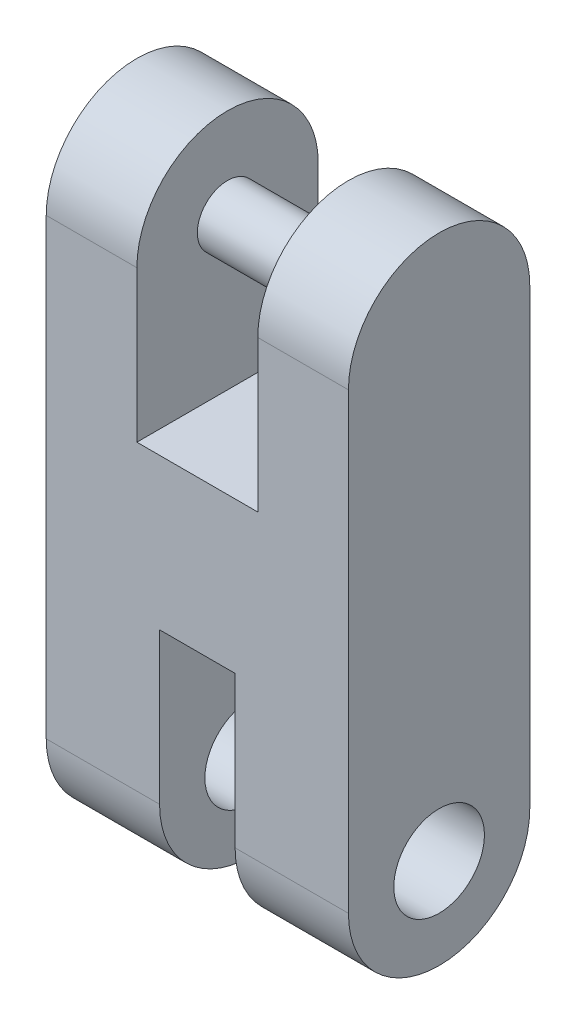
ISO-10303-21;
HEADER;
FILE_DESCRIPTION(('STEP AP214'),'2;1');
FILE_NAME('part.step','',(''),(''),'','','');
FILE_SCHEMA(('AUTOMOTIVE_DESIGN { 1 0 10303 214 1 1 1 1 }'));
ENDSEC;
DATA;
#1=APPLICATION_CONTEXT('core data for automotive mechanical design processes');
#2=APPLICATION_PROTOCOL_DEFINITION('international standard','automotive_design',2000,#1);
#3=PRODUCT_CONTEXT('',#1,'mechanical');
#4=PRODUCT('Part','Part','',(#3));
#5=PRODUCT_RELATED_PRODUCT_CATEGORY('part','',(#4));
#6=PRODUCT_DEFINITION_FORMATION('','',#4);
#7=PRODUCT_DEFINITION_CONTEXT('part definition',#1,'design');
#8=PRODUCT_DEFINITION('design','',#6,#7);
#9=PRODUCT_DEFINITION_SHAPE('','',#8);
#10=(LENGTH_UNIT() NAMED_UNIT(*) SI_UNIT(.MILLI.,.METRE.));
#11=(NAMED_UNIT(*) PLANE_ANGLE_UNIT() SI_UNIT($,.RADIAN.));
#12=(NAMED_UNIT(*) SI_UNIT($,.STERADIAN.) SOLID_ANGLE_UNIT());
#13=UNCERTAINTY_MEASURE_WITH_UNIT(LENGTH_MEASURE(1.E-05),#10,'distance_accuracy_value','');
#14=(GEOMETRIC_REPRESENTATION_CONTEXT(3) GLOBAL_UNCERTAINTY_ASSIGNED_CONTEXT((#13)) GLOBAL_UNIT_ASSIGNED_CONTEXT((#10,
#11,#12)) REPRESENTATION_CONTEXT('',''));
#15=CARTESIAN_POINT('',(0.,0.,0.));
#16=DIRECTION('',(0.,0.,1.));
#17=DIRECTION('',(1.,0.,0.));
#18=AXIS2_PLACEMENT_3D('',#15,#16,#17);
#19=CARTESIAN_POINT('',(-6.25,3.,3.));
#20=DIRECTION('',(1.,0.,0.));
#21=DIRECTION('',(0.,1.,0.));
#22=AXIS2_PLACEMENT_3D('',#19,#20,#21);
#23=CYLINDRICAL_SURFACE('',#22,3.);
#24=DIRECTION('',(1.,0.,0.));
#25=VECTOR('',#24,1.);
#26=CARTESIAN_POINT('',(0.,3.,0.));
#27=LINE('',#26,#25);
#28=CARTESIAN_POINT('',(-6.25,3.,0.));
#29=VERTEX_POINT('',#28);
#30=CARTESIAN_POINT('',(-10.,3.,0.));
#31=VERTEX_POINT('',#30);
#32=EDGE_CURVE('E259',#29,#31,#27,.F.);
#33=ORIENTED_EDGE('',*,*,#32,.F.);
#34=CARTESIAN_POINT('',(-6.25,3.,3.));
#35=DIRECTION('',(-1.,0.,0.));
#36=DIRECTION('',(0.,0.,1.));
#37=AXIS2_PLACEMENT_3D('',#34,#35,#36);
#38=CIRCLE('',#37,3.);
#39=CARTESIAN_POINT('',(-6.25,3.,6.));
#40=VERTEX_POINT('',#39);
#41=EDGE_CURVE('E55',#40,#29,#38,.F.);
#42=ORIENTED_EDGE('',*,*,#41,.F.);
#43=DIRECTION('',(-1.,0.,0.));
#44=VECTOR('',#43,1.);
#45=CARTESIAN_POINT('',(-6.25,3.,6.));
#46=LINE('',#45,#44);
#47=CARTESIAN_POINT('',(-10.,3.,6.));
#48=VERTEX_POINT('',#47);
#49=EDGE_CURVE('E263',#48,#40,#46,.F.);
#50=ORIENTED_EDGE('',*,*,#49,.F.);
#51=CARTESIAN_POINT('',(-10.,3.,3.));
#52=DIRECTION('',(1.,0.,0.));
#53=DIRECTION('',(0.,1.,0.));
#54=AXIS2_PLACEMENT_3D('',#51,#52,#53);
#55=CIRCLE('',#54,3.);
#56=EDGE_CURVE('E11',#31,#48,#55,.F.);
#57=ORIENTED_EDGE('',*,*,#56,.F.);
#58=EDGE_LOOP('',(#33,#42,#50,#57));
#59=FACE_BOUND('',#58,.T.);
#60=ADVANCED_FACE('F45',(#59),#23,.T.);
#61=CARTESIAN_POINT('',(-10.,18.,3.));
#62=DIRECTION('',(-1.,0.,0.));
#63=DIRECTION('',(0.,-1.,0.));
#64=AXIS2_PLACEMENT_3D('',#61,#62,#63);
#65=CYLINDRICAL_SURFACE('',#64,3.);
#66=DIRECTION('',(-1.,0.,0.));
#67=VECTOR('',#66,1.);
#68=CARTESIAN_POINT('',(0.,18.,0.));
#69=LINE('',#68,#67);
#70=CARTESIAN_POINT('',(-10.,18.,0.));
#71=VERTEX_POINT('',#70);
#72=CARTESIAN_POINT('',(-7.,18.,0.));
#73=VERTEX_POINT('',#72);
#74=EDGE_CURVE('E245',#71,#73,#69,.F.);
#75=ORIENTED_EDGE('',*,*,#74,.F.);
#76=CARTESIAN_POINT('',(-10.,18.,3.));
#77=DIRECTION('',(1.,0.,0.));
#78=DIRECTION('',(0.,1.,0.));
#79=AXIS2_PLACEMENT_3D('',#76,#77,#78);
#80=CIRCLE('',#79,3.);
#81=CARTESIAN_POINT('',(-10.,18.,6.));
#82=VERTEX_POINT('',#81);
#83=EDGE_CURVE('E253',#82,#71,#80,.F.);
#84=ORIENTED_EDGE('',*,*,#83,.F.);
#85=DIRECTION('',(1.,0.,0.));
#86=VECTOR('',#85,1.);
#87=CARTESIAN_POINT('',(-10.,18.,6.));
#88=LINE('',#87,#86);
#89=CARTESIAN_POINT('',(-7.,18.,6.));
#90=VERTEX_POINT('',#89);
#91=EDGE_CURVE('E249',#90,#82,#88,.F.);
#92=ORIENTED_EDGE('',*,*,#91,.F.);
#93=CARTESIAN_POINT('',(-7.,18.,3.));
#94=DIRECTION('',(-1.,0.,0.));
#95=DIRECTION('',(0.,-1.,0.));
#96=AXIS2_PLACEMENT_3D('',#93,#94,#95);
#97=CIRCLE('',#96,3.);
#98=EDGE_CURVE('E256',#73,#90,#97,.F.);
#99=ORIENTED_EDGE('',*,*,#98,.F.);
#100=EDGE_LOOP('',(#75,#84,#92,#99));
#101=FACE_BOUND('',#100,.T.);
#102=ADVANCED_FACE('F290',(#101),#65,.T.);
#103=CARTESIAN_POINT('',(0.,18.,3.));
#104=DIRECTION('',(-1.,0.,0.));
#105=DIRECTION('',(0.,-1.,0.));
#106=AXIS2_PLACEMENT_3D('',#103,#104,#105);
#107=CYLINDRICAL_SURFACE('',#106,3.);
#108=DIRECTION('',(1.,0.,0.));
#109=VECTOR('',#108,1.);
#110=CARTESIAN_POINT('',(0.,18.,6.));
#111=LINE('',#110,#109);
#112=CARTESIAN_POINT('',(0.,18.,6.));
#113=VERTEX_POINT('',#112);
#114=CARTESIAN_POINT('',(-3.,18.,6.));
#115=VERTEX_POINT('',#114);
#116=EDGE_CURVE('E144',#113,#115,#111,.F.);
#117=ORIENTED_EDGE('',*,*,#116,.F.);
#118=CARTESIAN_POINT('',(0.,18.,3.));
#119=DIRECTION('',(-1.,0.,0.));
#120=DIRECTION('',(0.,0.,1.));
#121=AXIS2_PLACEMENT_3D('',#118,#119,#120);
#122=CIRCLE('',#121,3.);
#123=CARTESIAN_POINT('',(0.,18.,0.));
#124=VERTEX_POINT('',#123);
#125=EDGE_CURVE('E239',#124,#113,#122,.F.);
#126=ORIENTED_EDGE('',*,*,#125,.F.);
#127=DIRECTION('',(-1.,0.,0.));
#128=VECTOR('',#127,1.);
#129=CARTESIAN_POINT('',(0.,18.,0.));
#130=LINE('',#129,#128);
#131=CARTESIAN_POINT('',(-3.,18.,0.));
#132=VERTEX_POINT('',#131);
#133=EDGE_CURVE('E235',#132,#124,#130,.F.);
#134=ORIENTED_EDGE('',*,*,#133,.F.);
#135=CARTESIAN_POINT('',(-3.,18.,3.));
#136=DIRECTION('',(1.,0.,0.));
#137=DIRECTION('',(0.,1.,0.));
#138=AXIS2_PLACEMENT_3D('',#135,#136,#137);
#139=CIRCLE('',#138,3.);
#140=EDGE_CURVE('E242',#115,#132,#139,.F.);
#141=ORIENTED_EDGE('',*,*,#140,.F.);
#142=EDGE_LOOP('',(#117,#126,#134,#141));
#143=FACE_BOUND('',#142,.T.);
#144=ADVANCED_FACE('F310',(#143),#107,.T.);
#145=CARTESIAN_POINT('',(-7.5,3.,3.));
#146=DIRECTION('',(1.,0.,0.));
#147=DIRECTION('',(0.,1.,0.));
#148=AXIS2_PLACEMENT_3D('',#145,#146,#147);
#149=CYLINDRICAL_SURFACE('',#148,3.);
#150=DIRECTION('',(-1.,0.,0.));
#151=VECTOR('',#150,1.);
#152=CARTESIAN_POINT('',(-7.5,3.,6.));
#153=LINE('',#152,#151);
#154=CARTESIAN_POINT('',(-3.75,3.,6.));
#155=VERTEX_POINT('',#154);
#156=CARTESIAN_POINT('',(0.,3.,6.));
#157=VERTEX_POINT('',#156);
#158=EDGE_CURVE('E157',#155,#157,#153,.F.);
#159=ORIENTED_EDGE('',*,*,#158,.F.);
#160=CARTESIAN_POINT('',(-3.75,3.,3.));
#161=DIRECTION('',(1.,0.,0.));
#162=DIRECTION('',(0.,1.,0.));
#163=AXIS2_PLACEMENT_3D('',#160,#161,#162);
#164=CIRCLE('',#163,3.);
#165=CARTESIAN_POINT('',(-3.75,3.,0.));
#166=VERTEX_POINT('',#165);
#167=EDGE_CURVE('E227',#166,#155,#164,.F.);
#168=ORIENTED_EDGE('',*,*,#167,.F.);
#169=DIRECTION('',(1.,0.,0.));
#170=VECTOR('',#169,1.);
#171=CARTESIAN_POINT('',(0.,3.,0.));
#172=LINE('',#171,#170);
#173=CARTESIAN_POINT('',(0.,3.,0.));
#174=VERTEX_POINT('',#173);
#175=EDGE_CURVE('E223',#174,#166,#172,.F.);
#176=ORIENTED_EDGE('',*,*,#175,.F.);
#177=CARTESIAN_POINT('',(0.,3.,3.));
#178=DIRECTION('',(-1.,0.,0.));
#179=DIRECTION('',(0.,0.,1.));
#180=AXIS2_PLACEMENT_3D('',#177,#178,#179);
#181=CIRCLE('',#180,3.);
#182=EDGE_CURVE('E230',#157,#174,#181,.F.);
#183=ORIENTED_EDGE('',*,*,#182,.F.);
#184=EDGE_LOOP('',(#159,#168,#176,#183));
#185=FACE_BOUND('',#184,.T.);
#186=ADVANCED_FACE('F314',(#185),#149,.T.);
#187=CARTESIAN_POINT('',(0.,0.,6.));
#188=DIRECTION('',(-1.,0.,0.));
#189=DIRECTION('',(0.,0.,1.));
#190=AXIS2_PLACEMENT_3D('',#187,#188,#189);
#191=PLANE('',#190);
#192=CARTESIAN_POINT('',(0.,3.,3.));
#193=DIRECTION('',(1.,0.,0.));
#194=DIRECTION('',(0.,0.,-1.));
#195=AXIS2_PLACEMENT_3D('',#192,#193,#194);
#196=CIRCLE('',#195,1.5);
#197=CARTESIAN_POINT('',(0.,3.,1.5));
#198=VERTEX_POINT('',#197);
#199=EDGE_CURVE('E343',#198,#198,#196,.T.);
#200=ORIENTED_EDGE('',*,*,#199,.F.);
#201=EDGE_LOOP('',(#200));
#202=FACE_BOUND('',#201,.T.);
#203=DIRECTION('',(0.,1.,0.));
#204=VECTOR('',#203,1.);
#205=CARTESIAN_POINT('',(0.,0.,0.));
#206=LINE('',#205,#204);
#207=EDGE_CURVE('E184',#174,#124,#206,.T.);
#208=ORIENTED_EDGE('',*,*,#207,.T.);
#209=ORIENTED_EDGE('',*,*,#125,.T.);
#210=DIRECTION('',(0.,1.,0.));
#211=VECTOR('',#210,1.);
#212=CARTESIAN_POINT('',(0.,0.,6.));
#213=LINE('',#212,#211);
#214=EDGE_CURVE('E147',#157,#113,#213,.T.);
#215=ORIENTED_EDGE('',*,*,#214,.F.);
#216=ORIENTED_EDGE('',*,*,#182,.T.);
#217=EDGE_LOOP('',(#208,#209,#215,#216));
#218=FACE_BOUND('',#217,.T.);
#219=ADVANCED_FACE('F329',(#202,#218),#191,.F.);
#220=CARTESIAN_POINT('',(-3.,13.,6.));
#221=DIRECTION('',(1.,0.,0.));
#222=DIRECTION('',(0.,1.,0.));
#223=AXIS2_PLACEMENT_3D('',#220,#221,#222);
#224=PLANE('',#223);
#225=CARTESIAN_POINT('',(-3.,18.,3.));
#226=DIRECTION('',(1.,0.,0.));
#227=DIRECTION('',(0.,1.,0.));
#228=AXIS2_PLACEMENT_3D('',#225,#226,#227);
#229=CIRCLE('',#228,1.00000000000001);
#230=CARTESIAN_POINT('',(-3.,19.,3.));
#231=VERTEX_POINT('',#230);
#232=EDGE_CURVE('E340',#231,#231,#229,.T.);
#233=ORIENTED_EDGE('',*,*,#232,.T.);
#234=EDGE_LOOP('',(#233));
#235=FACE_BOUND('',#234,.T.);
#236=DIRECTION('',(0.,-1.,0.));
#237=VECTOR('',#236,1.);
#238=CARTESIAN_POINT('',(-3.,13.,6.));
#239=LINE('',#238,#237);
#240=CARTESIAN_POINT('',(-3.,13.,6.));
#241=VERTEX_POINT('',#240);
#242=EDGE_CURVE('E134',#115,#241,#239,.T.);
#243=ORIENTED_EDGE('',*,*,#242,.F.);
#244=ORIENTED_EDGE('',*,*,#140,.T.);
#245=DIRECTION('',(0.,-1.,0.));
#246=VECTOR('',#245,1.);
#247=CARTESIAN_POINT('',(-3.,13.,0.));
#248=LINE('',#247,#246);
#249=CARTESIAN_POINT('',(-3.,13.,0.));
#250=VERTEX_POINT('',#249);
#251=EDGE_CURVE('E153',#132,#250,#248,.T.);
#252=ORIENTED_EDGE('',*,*,#251,.T.);
#253=DIRECTION('',(0.,0.,-1.));
#254=VECTOR('',#253,1.);
#255=CARTESIAN_POINT('',(-3.,13.,6.));
#256=LINE('',#255,#254);
#257=EDGE_CURVE('E150',#241,#250,#256,.T.);
#258=ORIENTED_EDGE('',*,*,#257,.F.);
#259=EDGE_LOOP('',(#243,#244,#252,#258));
#260=FACE_BOUND('',#259,.T.);
#261=ADVANCED_FACE('F151',(#235,#260),#224,.F.);
#262=CARTESIAN_POINT('',(-7.,13.,6.));
#263=DIRECTION('',(0.,-1.,0.));
#264=DIRECTION('',(0.,0.,-1.));
#265=AXIS2_PLACEMENT_3D('',#262,#263,#264);
#266=PLANE('',#265);
#267=DIRECTION('',(-1.,0.,0.));
#268=VECTOR('',#267,1.);
#269=CARTESIAN_POINT('',(-7.,13.,0.));
#270=LINE('',#269,#268);
#271=CARTESIAN_POINT('',(-7.,13.,0.));
#272=VERTEX_POINT('',#271);
#273=EDGE_CURVE('E191',#250,#272,#270,.T.);
#274=ORIENTED_EDGE('',*,*,#273,.T.);
#275=DIRECTION('',(0.,0.,-1.));
#276=VECTOR('',#275,1.);
#277=CARTESIAN_POINT('',(-7.,13.,6.));
#278=LINE('',#277,#276);
#279=CARTESIAN_POINT('',(-7.,13.,6.));
#280=VERTEX_POINT('',#279);
#281=EDGE_CURVE('E158',#280,#272,#278,.T.);
#282=ORIENTED_EDGE('',*,*,#281,.F.);
#283=DIRECTION('',(-1.,0.,0.));
#284=VECTOR('',#283,1.);
#285=CARTESIAN_POINT('',(-7.,13.,6.));
#286=LINE('',#285,#284);
#287=EDGE_CURVE('E140',#241,#280,#286,.T.);
#288=ORIENTED_EDGE('',*,*,#287,.F.);
#289=ORIENTED_EDGE('',*,*,#257,.T.);
#290=EDGE_LOOP('',(#274,#282,#288,#289));
#291=FACE_BOUND('',#290,.T.);
#292=ADVANCED_FACE('F160',(#291),#266,.F.);
#293=CARTESIAN_POINT('',(-7.,21.,6.));
#294=DIRECTION('',(-1.,0.,0.));
#295=DIRECTION('',(0.,-1.,0.));
#296=AXIS2_PLACEMENT_3D('',#293,#294,#295);
#297=PLANE('',#296);
#298=CARTESIAN_POINT('',(-7.,18.,3.));
#299=DIRECTION('',(-1.,0.,0.));
#300=DIRECTION('',(0.,-1.,0.));
#301=AXIS2_PLACEMENT_3D('',#298,#299,#300);
#302=CIRCLE('',#301,1.00000000000001);
#303=CARTESIAN_POINT('',(-7.,17.,3.));
#304=VERTEX_POINT('',#303);
#305=EDGE_CURVE('E344',#304,#304,#302,.T.);
#306=ORIENTED_EDGE('',*,*,#305,.T.);
#307=EDGE_LOOP('',(#306));
#308=FACE_BOUND('',#307,.T.);
#309=DIRECTION('',(0.,1.,0.));
#310=VECTOR('',#309,1.);
#311=CARTESIAN_POINT('',(-7.,21.,0.));
#312=LINE('',#311,#310);
#313=EDGE_CURVE('E194',#272,#73,#312,.T.);
#314=ORIENTED_EDGE('',*,*,#313,.T.);
#315=ORIENTED_EDGE('',*,*,#98,.T.);
#316=DIRECTION('',(0.,1.,0.));
#317=VECTOR('',#316,1.);
#318=CARTESIAN_POINT('',(-7.,21.,6.));
#319=LINE('',#318,#317);
#320=EDGE_CURVE('E164',#280,#90,#319,.T.);
#321=ORIENTED_EDGE('',*,*,#320,.F.);
#322=ORIENTED_EDGE('',*,*,#281,.T.);
#323=EDGE_LOOP('',(#314,#315,#321,#322));
#324=FACE_BOUND('',#323,.T.);
#325=ADVANCED_FACE('F293',(#308,#324),#297,.F.);
#326=CARTESIAN_POINT('',(-10.,0.,6.));
#327=DIRECTION('',(1.,0.,0.));
#328=DIRECTION('',(0.,1.,0.));
#329=AXIS2_PLACEMENT_3D('',#326,#327,#328);
#330=PLANE('',#329);
#331=CARTESIAN_POINT('',(-10.,3.,3.));
#332=DIRECTION('',(1.,0.,0.));
#333=DIRECTION('',(0.,1.,0.));
#334=AXIS2_PLACEMENT_3D('',#331,#332,#333);
#335=CIRCLE('',#334,1.5);
#336=CARTESIAN_POINT('',(-10.,4.5,3.));
#337=VERTEX_POINT('',#336);
#338=EDGE_CURVE('E349',#337,#337,#335,.F.);
#339=ORIENTED_EDGE('',*,*,#338,.F.);
#340=EDGE_LOOP('',(#339));
#341=FACE_BOUND('',#340,.T.);
#342=DIRECTION('',(0.,-1.,0.));
#343=VECTOR('',#342,1.);
#344=CARTESIAN_POINT('',(-10.,0.,0.));
#345=LINE('',#344,#343);
#346=EDGE_CURVE('E198',#71,#31,#345,.T.);
#347=ORIENTED_EDGE('',*,*,#346,.T.);
#348=ORIENTED_EDGE('',*,*,#56,.T.);
#349=DIRECTION('',(0.,-1.,0.));
#350=VECTOR('',#349,1.);
#351=CARTESIAN_POINT('',(-10.,0.,6.));
#352=LINE('',#351,#350);
#353=EDGE_CURVE('E167',#82,#48,#352,.T.);
#354=ORIENTED_EDGE('',*,*,#353,.F.);
#355=ORIENTED_EDGE('',*,*,#83,.T.);
#356=EDGE_LOOP('',(#347,#348,#354,#355));
#357=FACE_BOUND('',#356,.T.);
#358=ADVANCED_FACE('F287',(#341,#357),#330,.F.);
#359=CARTESIAN_POINT('',(-6.25,0.,6.));
#360=DIRECTION('',(-1.,0.,0.));
#361=DIRECTION('',(0.,0.,1.));
#362=AXIS2_PLACEMENT_3D('',#359,#360,#361);
#363=PLANE('',#362);
#364=CARTESIAN_POINT('',(-6.25,3.,3.));
#365=DIRECTION('',(-1.,0.,0.));
#366=DIRECTION('',(0.,0.,1.));
#367=AXIS2_PLACEMENT_3D('',#364,#365,#366);
#368=CIRCLE('',#367,1.5);
#369=CARTESIAN_POINT('',(-6.25,3.,4.5));
#370=VERTEX_POINT('',#369);
#371=EDGE_CURVE('E188',#370,#370,#368,.T.);
#372=ORIENTED_EDGE('',*,*,#371,.T.);
#373=EDGE_LOOP('',(#372));
#374=FACE_BOUND('',#373,.T.);
#375=DIRECTION('',(0.,1.,0.));
#376=VECTOR('',#375,1.);
#377=CARTESIAN_POINT('',(-6.25,0.,6.));
#378=LINE('',#377,#376);
#379=CARTESIAN_POINT('',(-6.25,8.,6.));
#380=VERTEX_POINT('',#379);
#381=EDGE_CURVE('E173',#40,#380,#378,.T.);
#382=ORIENTED_EDGE('',*,*,#381,.F.);
#383=ORIENTED_EDGE('',*,*,#41,.T.);
#384=DIRECTION('',(0.,1.,0.));
#385=VECTOR('',#384,1.);
#386=CARTESIAN_POINT('',(-6.25,0.,0.));
#387=LINE('',#386,#385);
#388=CARTESIAN_POINT('',(-6.25,8.,0.));
#389=VERTEX_POINT('',#388);
#390=EDGE_CURVE('E201',#29,#389,#387,.T.);
#391=ORIENTED_EDGE('',*,*,#390,.T.);
#392=DIRECTION('',(0.,0.,-1.));
#393=VECTOR('',#392,1.);
#394=CARTESIAN_POINT('',(-6.25,8.,6.));
#395=LINE('',#394,#393);
#396=EDGE_CURVE('E214',#380,#389,#395,.T.);
#397=ORIENTED_EDGE('',*,*,#396,.F.);
#398=EDGE_LOOP('',(#382,#383,#391,#397));
#399=FACE_BOUND('',#398,.T.);
#400=ADVANCED_FACE('F269',(#374,#399),#363,.F.);
#401=CARTESIAN_POINT('',(-6.25,8.,6.));
#402=DIRECTION('',(0.,1.,0.));
#403=DIRECTION('',(-1.,0.,0.));
#404=AXIS2_PLACEMENT_3D('',#401,#402,#403);
#405=PLANE('',#404);
#406=DIRECTION('',(1.,0.,0.));
#407=VECTOR('',#406,1.);
#408=CARTESIAN_POINT('',(-6.25,8.,0.));
#409=LINE('',#408,#407);
#410=CARTESIAN_POINT('',(-3.75,8.,0.));
#411=VERTEX_POINT('',#410);
#412=EDGE_CURVE('E204',#389,#411,#409,.T.);
#413=ORIENTED_EDGE('',*,*,#412,.T.);
#414=DIRECTION('',(0.,0.,-1.));
#415=VECTOR('',#414,1.);
#416=CARTESIAN_POINT('',(-3.75,8.,6.));
#417=LINE('',#416,#415);
#418=CARTESIAN_POINT('',(-3.75,8.,6.));
#419=VERTEX_POINT('',#418);
#420=EDGE_CURVE('E183',#419,#411,#417,.T.);
#421=ORIENTED_EDGE('',*,*,#420,.F.);
#422=DIRECTION('',(1.,0.,0.));
#423=VECTOR('',#422,1.);
#424=CARTESIAN_POINT('',(-6.25,8.,6.));
#425=LINE('',#424,#423);
#426=EDGE_CURVE('E176',#380,#419,#425,.T.);
#427=ORIENTED_EDGE('',*,*,#426,.F.);
#428=ORIENTED_EDGE('',*,*,#396,.T.);
#429=EDGE_LOOP('',(#413,#421,#427,#428));
#430=FACE_BOUND('',#429,.T.);
#431=ADVANCED_FACE('F279',(#430),#405,.F.);
#432=CARTESIAN_POINT('',(-3.75,8.,6.));
#433=DIRECTION('',(1.,0.,0.));
#434=DIRECTION('',(0.,1.,0.));
#435=AXIS2_PLACEMENT_3D('',#432,#433,#434);
#436=PLANE('',#435);
#437=CARTESIAN_POINT('',(-3.75,3.,3.));
#438=DIRECTION('',(1.,0.,0.));
#439=DIRECTION('',(0.,1.,0.));
#440=AXIS2_PLACEMENT_3D('',#437,#438,#439);
#441=CIRCLE('',#440,1.5);
#442=CARTESIAN_POINT('',(-3.75,4.5,3.));
#443=VERTEX_POINT('',#442);
#444=EDGE_CURVE('E49',#443,#443,#441,.T.);
#445=ORIENTED_EDGE('',*,*,#444,.T.);
#446=EDGE_LOOP('',(#445));
#447=FACE_BOUND('',#446,.T.);
#448=DIRECTION('',(0.,-1.,0.));
#449=VECTOR('',#448,1.);
#450=CARTESIAN_POINT('',(-3.75,8.,0.));
#451=LINE('',#450,#449);
#452=EDGE_CURVE('E207',#411,#166,#451,.T.);
#453=ORIENTED_EDGE('',*,*,#452,.T.);
#454=ORIENTED_EDGE('',*,*,#167,.T.);
#455=DIRECTION('',(0.,-1.,0.));
#456=VECTOR('',#455,1.);
#457=CARTESIAN_POINT('',(-3.75,8.,6.));
#458=LINE('',#457,#456);
#459=EDGE_CURVE('E179',#419,#155,#458,.T.);
#460=ORIENTED_EDGE('',*,*,#459,.F.);
#461=ORIENTED_EDGE('',*,*,#420,.T.);
#462=EDGE_LOOP('',(#453,#454,#460,#461));
#463=FACE_BOUND('',#462,.T.);
#464=ADVANCED_FACE('F283',(#447,#463),#436,.F.);
#465=CARTESIAN_POINT('',(0.,0.,6.));
#466=DIRECTION('',(0.,0.,1.));
#467=DIRECTION('',(1.,0.,0.));
#468=AXIS2_PLACEMENT_3D('',#465,#466,#467);
#469=PLANE('',#468);
#470=ORIENTED_EDGE('',*,*,#353,.T.);
#471=ORIENTED_EDGE('',*,*,#49,.T.);
#472=ORIENTED_EDGE('',*,*,#381,.T.);
#473=ORIENTED_EDGE('',*,*,#426,.T.);
#474=ORIENTED_EDGE('',*,*,#459,.T.);
#475=ORIENTED_EDGE('',*,*,#158,.T.);
#476=ORIENTED_EDGE('',*,*,#214,.T.);
#477=ORIENTED_EDGE('',*,*,#116,.T.);
#478=ORIENTED_EDGE('',*,*,#242,.T.);
#479=ORIENTED_EDGE('',*,*,#287,.T.);
#480=ORIENTED_EDGE('',*,*,#320,.T.);
#481=ORIENTED_EDGE('',*,*,#91,.T.);
#482=EDGE_LOOP('',(#470,#471,#472,#473,#474,#475,#476,#477,#478,#479,#480,#481));
#483=FACE_BOUND('',#482,.T.);
#484=ADVANCED_FACE('F137',(#483),#469,.T.);
#485=CARTESIAN_POINT('',(0.,0.,0.));
#486=DIRECTION('',(0.,0.,1.));
#487=DIRECTION('',(1.,0.,0.));
#488=AXIS2_PLACEMENT_3D('',#485,#486,#487);
#489=PLANE('',#488);
#490=ORIENTED_EDGE('',*,*,#390,.F.);
#491=ORIENTED_EDGE('',*,*,#32,.T.);
#492=ORIENTED_EDGE('',*,*,#346,.F.);
#493=ORIENTED_EDGE('',*,*,#74,.T.);
#494=ORIENTED_EDGE('',*,*,#313,.F.);
#495=ORIENTED_EDGE('',*,*,#273,.F.);
#496=ORIENTED_EDGE('',*,*,#251,.F.);
#497=ORIENTED_EDGE('',*,*,#133,.T.);
#498=ORIENTED_EDGE('',*,*,#207,.F.);
#499=ORIENTED_EDGE('',*,*,#175,.T.);
#500=ORIENTED_EDGE('',*,*,#452,.F.);
#501=ORIENTED_EDGE('',*,*,#412,.F.);
#502=EDGE_LOOP('',(#490,#491,#492,#493,#494,#495,#496,#497,#498,#499,#500,#501));
#503=FACE_BOUND('',#502,.T.);
#504=ADVANCED_FACE('F275',(#503),#489,.F.);
#505=CARTESIAN_POINT('',(-14.2426406871193,3.,3.));
#506=DIRECTION('',(1.,0.,0.));
#507=DIRECTION('',(0.,0.,-1.));
#508=AXIS2_PLACEMENT_3D('',#505,#506,#507);
#509=CYLINDRICAL_SURFACE('',#508,1.5);
#510=ORIENTED_EDGE('',*,*,#199,.T.);
#511=EDGE_LOOP('',(#510));
#512=FACE_BOUND('',#511,.T.);
#513=ORIENTED_EDGE('',*,*,#444,.F.);
#514=EDGE_LOOP('',(#513));
#515=FACE_BOUND('',#514,.T.);
#516=ADVANCED_FACE('F368',(#512,#515),#509,.F.);
#517=ORIENTED_EDGE('',*,*,#338,.T.);
#518=EDGE_LOOP('',(#517));
#519=FACE_BOUND('',#518,.T.);
#520=ORIENTED_EDGE('',*,*,#371,.F.);
#521=EDGE_LOOP('',(#520));
#522=FACE_BOUND('',#521,.T.);
#523=ADVANCED_FACE('F370',(#519,#522),#509,.F.);
#524=CARTESIAN_POINT('',(0.,18.,3.));
#525=DIRECTION('',(-1.,0.,0.));
#526=DIRECTION('',(0.,-1.,0.));
#527=AXIS2_PLACEMENT_3D('',#524,#525,#526);
#528=CYLINDRICAL_SURFACE('',#527,1.00000000000001);
#529=ORIENTED_EDGE('',*,*,#305,.F.);
#530=EDGE_LOOP('',(#529));
#531=FACE_BOUND('',#530,.T.);
#532=ORIENTED_EDGE('',*,*,#232,.F.);
#533=EDGE_LOOP('',(#532));
#534=FACE_BOUND('',#533,.T.);
#535=ADVANCED_FACE('F377',(#531,#534),#528,.T.);
#536=CLOSED_SHELL('',(#60,#102,#144,#186,#219,#261,#292,#325,#358,#400,#431,#464,#484,#504,#516,
#523,#535));
#537=MANIFOLD_SOLID_BREP('B2',#536);
#538=ADVANCED_BREP_SHAPE_REPRESENTATION('',(#18,#537),#14);
#539=SHAPE_DEFINITION_REPRESENTATION(#9,#538);
ENDSEC;
END-ISO-10303-21;
